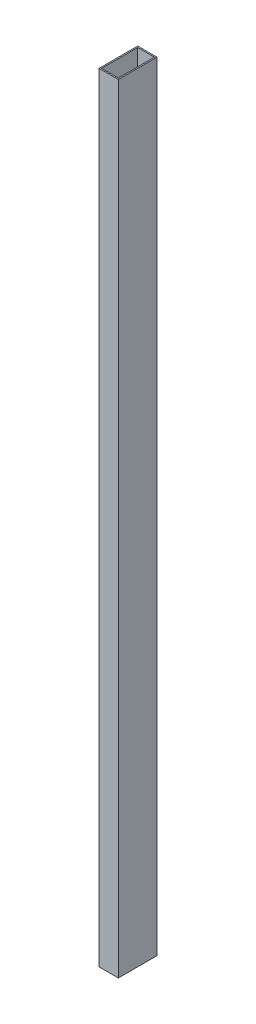
ISO-10303-21;
HEADER;
FILE_DESCRIPTION(('STEP AP214'),'2;1');
FILE_NAME('part.step','',(''),(''),'','','');
FILE_SCHEMA(('AUTOMOTIVE_DESIGN { 1 0 10303 214 1 1 1 1 }'));
ENDSEC;
DATA;
#1=APPLICATION_CONTEXT('core data for automotive mechanical design processes');
#2=APPLICATION_PROTOCOL_DEFINITION('international standard','automotive_design',2000,#1);
#3=PRODUCT_CONTEXT('',#1,'mechanical');
#4=PRODUCT('Part','Part','',(#3));
#5=PRODUCT_RELATED_PRODUCT_CATEGORY('part','',(#4));
#6=PRODUCT_DEFINITION_FORMATION('','',#4);
#7=PRODUCT_DEFINITION_CONTEXT('part definition',#1,'design');
#8=PRODUCT_DEFINITION('design','',#6,#7);
#9=PRODUCT_DEFINITION_SHAPE('','',#8);
#10=(LENGTH_UNIT() NAMED_UNIT(*) SI_UNIT(.MILLI.,.METRE.));
#11=(NAMED_UNIT(*) PLANE_ANGLE_UNIT() SI_UNIT($,.RADIAN.));
#12=(NAMED_UNIT(*) SI_UNIT($,.STERADIAN.) SOLID_ANGLE_UNIT());
#13=UNCERTAINTY_MEASURE_WITH_UNIT(LENGTH_MEASURE(1.E-05),#10,'distance_accuracy_value','');
#14=(GEOMETRIC_REPRESENTATION_CONTEXT(3) GLOBAL_UNCERTAINTY_ASSIGNED_CONTEXT((#13)) GLOBAL_UNIT_ASSIGNED_CONTEXT((#10,
#11,#12)) REPRESENTATION_CONTEXT('',''));
#15=CARTESIAN_POINT('',(0.,0.,0.));
#16=DIRECTION('',(0.,0.,1.));
#17=DIRECTION('',(1.,0.,0.));
#18=AXIS2_PLACEMENT_3D('',#15,#16,#17);
#19=CARTESIAN_POINT('',(0.,1022.35,0.));
#20=DIRECTION('',(0.,-1.,0.));
#21=DIRECTION('',(0.,0.,-1.));
#22=AXIS2_PLACEMENT_3D('',#19,#20,#21);
#23=PLANE('',#22);
#24=DIRECTION('',(0.,0.,1.));
#25=VECTOR('',#24,1.);
#26=CARTESIAN_POINT('',(-58.793006993007,1022.35,42.5706961617951));
#27=LINE('',#26,#25);
#28=CARTESIAN_POINT('',(-58.793006993007,1022.35,-8.22930383820489));
#29=VERTEX_POINT('',#28);
#30=CARTESIAN_POINT('',(-58.793006993007,1022.35,42.5706961617951));
#31=VERTEX_POINT('',#30);
#32=EDGE_CURVE('E133',#29,#31,#27,.T.);
#33=ORIENTED_EDGE('',*,*,#32,.T.);
#34=DIRECTION('',(1.,0.,0.));
#35=VECTOR('',#34,1.);
#36=CARTESIAN_POINT('',(-58.793006993007,1022.35,42.5706961617951));
#37=LINE('',#36,#35);
#38=CARTESIAN_POINT('',(-33.393006993007,1022.35,42.5706961617951));
#39=VERTEX_POINT('',#38);
#40=EDGE_CURVE('E136',#31,#39,#37,.T.);
#41=ORIENTED_EDGE('',*,*,#40,.T.);
#42=DIRECTION('',(0.,0.,-1.));
#43=VECTOR('',#42,1.);
#44=CARTESIAN_POINT('',(-33.393006993007,1022.35,42.5706961617951));
#45=LINE('',#44,#43);
#46=CARTESIAN_POINT('',(-33.393006993007,1022.35,-8.22930383820489));
#47=VERTEX_POINT('',#46);
#48=EDGE_CURVE('E139',#39,#47,#45,.T.);
#49=ORIENTED_EDGE('',*,*,#48,.T.);
#50=DIRECTION('',(-1.,0.,0.));
#51=VECTOR('',#50,1.);
#52=CARTESIAN_POINT('',(-58.793006993007,1022.35,-8.22930383820489));
#53=LINE('',#52,#51);
#54=EDGE_CURVE('E141',#47,#29,#53,.T.);
#55=ORIENTED_EDGE('',*,*,#54,.T.);
#56=EDGE_LOOP('',(#33,#41,#49,#55));
#57=FACE_BOUND('',#56,.T.);
#58=DIRECTION('',(0.,0.,-1.));
#59=VECTOR('',#58,1.);
#60=CARTESIAN_POINT('',(-35.044006993007,1022.35,-6.57830383820489));
#61=LINE('',#60,#59);
#62=CARTESIAN_POINT('',(-35.044006993007,1022.35,40.9196961617951));
#63=VERTEX_POINT('',#62);
#64=CARTESIAN_POINT('',(-35.044006993007,1022.35,-6.57830383820489));
#65=VERTEX_POINT('',#64);
#66=EDGE_CURVE('E97',#63,#65,#61,.T.);
#67=ORIENTED_EDGE('',*,*,#66,.F.);
#68=DIRECTION('',(1.,0.,0.));
#69=VECTOR('',#68,1.);
#70=CARTESIAN_POINT('',(-57.142006993007,1022.35,40.9196961617951));
#71=LINE('',#70,#69);
#72=CARTESIAN_POINT('',(-57.142006993007,1022.35,40.9196961617951));
#73=VERTEX_POINT('',#72);
#74=EDGE_CURVE('E119',#73,#63,#71,.T.);
#75=ORIENTED_EDGE('',*,*,#74,.F.);
#76=DIRECTION('',(0.,0.,1.));
#77=VECTOR('',#76,1.);
#78=CARTESIAN_POINT('',(-57.142006993007,1022.35,-6.57830383820489));
#79=LINE('',#78,#77);
#80=CARTESIAN_POINT('',(-57.142006993007,1022.35,-6.57830383820489));
#81=VERTEX_POINT('',#80);
#82=EDGE_CURVE('E117',#81,#73,#79,.T.);
#83=ORIENTED_EDGE('',*,*,#82,.F.);
#84=DIRECTION('',(-1.,0.,0.));
#85=VECTOR('',#84,1.);
#86=CARTESIAN_POINT('',(-57.142006993007,1022.35,-6.57830383820489));
#87=LINE('',#86,#85);
#88=EDGE_CURVE('E105',#65,#81,#87,.T.);
#89=ORIENTED_EDGE('',*,*,#88,.F.);
#90=EDGE_LOOP('',(#67,#75,#83,#89));
#91=FACE_BOUND('',#90,.T.);
#92=ADVANCED_FACE('F32',(#57,#91),#23,.F.);
#93=CARTESIAN_POINT('',(0.,0.,0.));
#94=DIRECTION('',(0.,-1.,0.));
#95=DIRECTION('',(0.,0.,-1.));
#96=AXIS2_PLACEMENT_3D('',#93,#94,#95);
#97=PLANE('',#96);
#98=DIRECTION('',(0.,0.,1.));
#99=VECTOR('',#98,1.);
#100=CARTESIAN_POINT('',(-58.793006993007,0.,42.5706961617951));
#101=LINE('',#100,#99);
#102=CARTESIAN_POINT('',(-58.793006993007,0.,-8.22930383820489));
#103=VERTEX_POINT('',#102);
#104=CARTESIAN_POINT('',(-58.793006993007,0.,42.5706961617951));
#105=VERTEX_POINT('',#104);
#106=EDGE_CURVE('E113',#103,#105,#101,.T.);
#107=ORIENTED_EDGE('',*,*,#106,.F.);
#108=DIRECTION('',(-1.,0.,0.));
#109=VECTOR('',#108,1.);
#110=CARTESIAN_POINT('',(-58.793006993007,0.,-8.22930383820489));
#111=LINE('',#110,#109);
#112=CARTESIAN_POINT('',(-33.393006993007,0.,-8.22930383820489));
#113=VERTEX_POINT('',#112);
#114=EDGE_CURVE('E137',#113,#103,#111,.T.);
#115=ORIENTED_EDGE('',*,*,#114,.F.);
#116=DIRECTION('',(0.,0.,-1.));
#117=VECTOR('',#116,1.);
#118=CARTESIAN_POINT('',(-33.393006993007,0.,42.5706961617951));
#119=LINE('',#118,#117);
#120=CARTESIAN_POINT('',(-33.393006993007,0.,42.5706961617951));
#121=VERTEX_POINT('',#120);
#122=EDGE_CURVE('E148',#121,#113,#119,.T.);
#123=ORIENTED_EDGE('',*,*,#122,.F.);
#124=DIRECTION('',(1.,0.,0.));
#125=VECTOR('',#124,1.);
#126=CARTESIAN_POINT('',(-58.793006993007,0.,42.5706961617951));
#127=LINE('',#126,#125);
#128=EDGE_CURVE('E146',#105,#121,#127,.T.);
#129=ORIENTED_EDGE('',*,*,#128,.F.);
#130=EDGE_LOOP('',(#107,#115,#123,#129));
#131=FACE_BOUND('',#130,.T.);
#132=DIRECTION('',(1.,0.,0.));
#133=VECTOR('',#132,1.);
#134=CARTESIAN_POINT('',(-57.142006993007,0.,40.9196961617951));
#135=LINE('',#134,#133);
#136=CARTESIAN_POINT('',(-57.142006993007,0.,40.9196961617951));
#137=VERTEX_POINT('',#136);
#138=CARTESIAN_POINT('',(-35.044006993007,0.,40.9196961617951));
#139=VERTEX_POINT('',#138);
#140=EDGE_CURVE('E106',#137,#139,#135,.T.);
#141=ORIENTED_EDGE('',*,*,#140,.T.);
#142=DIRECTION('',(0.,0.,-1.));
#143=VECTOR('',#142,1.);
#144=CARTESIAN_POINT('',(-35.044006993007,0.,-6.57830383820489));
#145=LINE('',#144,#143);
#146=CARTESIAN_POINT('',(-35.044006993007,0.,-6.57830383820489));
#147=VERTEX_POINT('',#146);
#148=EDGE_CURVE('E55',#139,#147,#145,.T.);
#149=ORIENTED_EDGE('',*,*,#148,.T.);
#150=DIRECTION('',(-1.,0.,0.));
#151=VECTOR('',#150,1.);
#152=CARTESIAN_POINT('',(-57.142006993007,0.,-6.57830383820489));
#153=LINE('',#152,#151);
#154=CARTESIAN_POINT('',(-57.142006993007,0.,-6.57830383820489));
#155=VERTEX_POINT('',#154);
#156=EDGE_CURVE('E112',#147,#155,#153,.T.);
#157=ORIENTED_EDGE('',*,*,#156,.T.);
#158=DIRECTION('',(0.,0.,1.));
#159=VECTOR('',#158,1.);
#160=CARTESIAN_POINT('',(-57.142006993007,0.,-6.57830383820489));
#161=LINE('',#160,#159);
#162=EDGE_CURVE('E125',#155,#137,#161,.T.);
#163=ORIENTED_EDGE('',*,*,#162,.T.);
#164=EDGE_LOOP('',(#141,#149,#157,#163));
#165=FACE_BOUND('',#164,.T.);
#166=ADVANCED_FACE('F166',(#131,#165),#97,.T.);
#167=CARTESIAN_POINT('',(-58.793006993007,1022.35,42.5706961617951));
#168=DIRECTION('',(1.,0.,0.));
#169=DIRECTION('',(0.,0.,-1.));
#170=AXIS2_PLACEMENT_3D('',#167,#168,#169);
#171=PLANE('',#170);
#172=ORIENTED_EDGE('',*,*,#106,.T.);
#173=DIRECTION('',(0.,-1.,0.));
#174=VECTOR('',#173,1.);
#175=CARTESIAN_POINT('',(-58.793006993007,1022.35,42.5706961617951));
#176=LINE('',#175,#174);
#177=EDGE_CURVE('E11',#31,#105,#176,.T.);
#178=ORIENTED_EDGE('',*,*,#177,.F.);
#179=ORIENTED_EDGE('',*,*,#32,.F.);
#180=DIRECTION('',(0.,-1.,0.));
#181=VECTOR('',#180,1.);
#182=CARTESIAN_POINT('',(-58.793006993007,1022.35,-8.22930383820489));
#183=LINE('',#182,#181);
#184=EDGE_CURVE('E143',#29,#103,#183,.T.);
#185=ORIENTED_EDGE('',*,*,#184,.T.);
#186=EDGE_LOOP('',(#172,#178,#179,#185));
#187=FACE_BOUND('',#186,.T.);
#188=ADVANCED_FACE('F34',(#187),#171,.F.);
#189=CARTESIAN_POINT('',(-58.793006993007,1022.35,42.5706961617951));
#190=DIRECTION('',(0.,0.,-1.));
#191=DIRECTION('',(-1.,0.,0.));
#192=AXIS2_PLACEMENT_3D('',#189,#190,#191);
#193=PLANE('',#192);
#194=ORIENTED_EDGE('',*,*,#128,.T.);
#195=DIRECTION('',(0.,-1.,0.));
#196=VECTOR('',#195,1.);
#197=CARTESIAN_POINT('',(-33.393006993007,1022.35,42.5706961617951));
#198=LINE('',#197,#196);
#199=EDGE_CURVE('E40',#39,#121,#198,.T.);
#200=ORIENTED_EDGE('',*,*,#199,.F.);
#201=ORIENTED_EDGE('',*,*,#40,.F.);
#202=ORIENTED_EDGE('',*,*,#177,.T.);
#203=EDGE_LOOP('',(#194,#200,#201,#202));
#204=FACE_BOUND('',#203,.T.);
#205=ADVANCED_FACE('F176',(#204),#193,.F.);
#206=CARTESIAN_POINT('',(-33.393006993007,1022.35,42.5706961617951));
#207=DIRECTION('',(-1.,0.,0.));
#208=DIRECTION('',(0.,0.,1.));
#209=AXIS2_PLACEMENT_3D('',#206,#207,#208);
#210=PLANE('',#209);
#211=ORIENTED_EDGE('',*,*,#122,.T.);
#212=DIRECTION('',(0.,-1.,0.));
#213=VECTOR('',#212,1.);
#214=CARTESIAN_POINT('',(-33.393006993007,1022.35,-8.22930383820489));
#215=LINE('',#214,#213);
#216=EDGE_CURVE('E153',#47,#113,#215,.T.);
#217=ORIENTED_EDGE('',*,*,#216,.F.);
#218=ORIENTED_EDGE('',*,*,#48,.F.);
#219=ORIENTED_EDGE('',*,*,#199,.T.);
#220=EDGE_LOOP('',(#211,#217,#218,#219));
#221=FACE_BOUND('',#220,.T.);
#222=ADVANCED_FACE('F160',(#221),#210,.F.);
#223=CARTESIAN_POINT('',(-58.793006993007,1022.35,-8.22930383820489));
#224=DIRECTION('',(0.,0.,1.));
#225=DIRECTION('',(1.,0.,0.));
#226=AXIS2_PLACEMENT_3D('',#223,#224,#225);
#227=PLANE('',#226);
#228=ORIENTED_EDGE('',*,*,#114,.T.);
#229=ORIENTED_EDGE('',*,*,#184,.F.);
#230=ORIENTED_EDGE('',*,*,#54,.F.);
#231=ORIENTED_EDGE('',*,*,#216,.T.);
#232=EDGE_LOOP('',(#228,#229,#230,#231));
#233=FACE_BOUND('',#232,.T.);
#234=ADVANCED_FACE('F170',(#233),#227,.F.);
#235=CARTESIAN_POINT('',(-35.044006993007,1022.35,-6.57830383820489));
#236=DIRECTION('',(-1.,0.,0.));
#237=DIRECTION('',(0.,0.,1.));
#238=AXIS2_PLACEMENT_3D('',#235,#236,#237);
#239=PLANE('',#238);
#240=ORIENTED_EDGE('',*,*,#148,.F.);
#241=DIRECTION('',(0.,-1.,0.));
#242=VECTOR('',#241,1.);
#243=CARTESIAN_POINT('',(-35.044006993007,1022.35,40.9196961617951));
#244=LINE('',#243,#242);
#245=EDGE_CURVE('E101',#63,#139,#244,.T.);
#246=ORIENTED_EDGE('',*,*,#245,.F.);
#247=ORIENTED_EDGE('',*,*,#66,.T.);
#248=DIRECTION('',(0.,-1.,0.));
#249=VECTOR('',#248,1.);
#250=CARTESIAN_POINT('',(-35.044006993007,1022.35,-6.57830383820489));
#251=LINE('',#250,#249);
#252=EDGE_CURVE('E100',#65,#147,#251,.T.);
#253=ORIENTED_EDGE('',*,*,#252,.T.);
#254=EDGE_LOOP('',(#240,#246,#247,#253));
#255=FACE_BOUND('',#254,.T.);
#256=ADVANCED_FACE('F99',(#255),#239,.T.);
#257=CARTESIAN_POINT('',(-57.142006993007,1022.35,-6.57830383820489));
#258=DIRECTION('',(0.,0.,1.));
#259=DIRECTION('',(1.,0.,0.));
#260=AXIS2_PLACEMENT_3D('',#257,#258,#259);
#261=PLANE('',#260);
#262=ORIENTED_EDGE('',*,*,#156,.F.);
#263=ORIENTED_EDGE('',*,*,#252,.F.);
#264=ORIENTED_EDGE('',*,*,#88,.T.);
#265=DIRECTION('',(0.,-1.,0.));
#266=VECTOR('',#265,1.);
#267=CARTESIAN_POINT('',(-57.142006993007,1022.35,-6.57830383820489));
#268=LINE('',#267,#266);
#269=EDGE_CURVE('E114',#81,#155,#268,.T.);
#270=ORIENTED_EDGE('',*,*,#269,.T.);
#271=EDGE_LOOP('',(#262,#263,#264,#270));
#272=FACE_BOUND('',#271,.T.);
#273=ADVANCED_FACE('F109',(#272),#261,.T.);
#274=CARTESIAN_POINT('',(-57.142006993007,1022.35,-6.57830383820489));
#275=DIRECTION('',(1.,0.,0.));
#276=DIRECTION('',(0.,0.,-1.));
#277=AXIS2_PLACEMENT_3D('',#274,#275,#276);
#278=PLANE('',#277);
#279=ORIENTED_EDGE('',*,*,#162,.F.);
#280=ORIENTED_EDGE('',*,*,#269,.F.);
#281=ORIENTED_EDGE('',*,*,#82,.T.);
#282=DIRECTION('',(0.,-1.,0.));
#283=VECTOR('',#282,1.);
#284=CARTESIAN_POINT('',(-57.142006993007,1022.35,40.9196961617951));
#285=LINE('',#284,#283);
#286=EDGE_CURVE('E47',#73,#137,#285,.T.);
#287=ORIENTED_EDGE('',*,*,#286,.T.);
#288=EDGE_LOOP('',(#279,#280,#281,#287));
#289=FACE_BOUND('',#288,.T.);
#290=ADVANCED_FACE('F199',(#289),#278,.T.);
#291=CARTESIAN_POINT('',(-57.142006993007,1022.35,40.9196961617951));
#292=DIRECTION('',(0.,0.,-1.));
#293=DIRECTION('',(-1.,0.,0.));
#294=AXIS2_PLACEMENT_3D('',#291,#292,#293);
#295=PLANE('',#294);
#296=ORIENTED_EDGE('',*,*,#140,.F.);
#297=ORIENTED_EDGE('',*,*,#286,.F.);
#298=ORIENTED_EDGE('',*,*,#74,.T.);
#299=ORIENTED_EDGE('',*,*,#245,.T.);
#300=EDGE_LOOP('',(#296,#297,#298,#299));
#301=FACE_BOUND('',#300,.T.);
#302=ADVANCED_FACE('F203',(#301),#295,.T.);
#303=CLOSED_SHELL('',(#92,#166,#188,#205,#222,#234,#256,#273,#290,#302));
#304=MANIFOLD_SOLID_BREP('B2',#303);
#305=ADVANCED_BREP_SHAPE_REPRESENTATION('',(#18,#304),#14);
#306=SHAPE_DEFINITION_REPRESENTATION(#9,#305);
ENDSEC;
END-ISO-10303-21;
